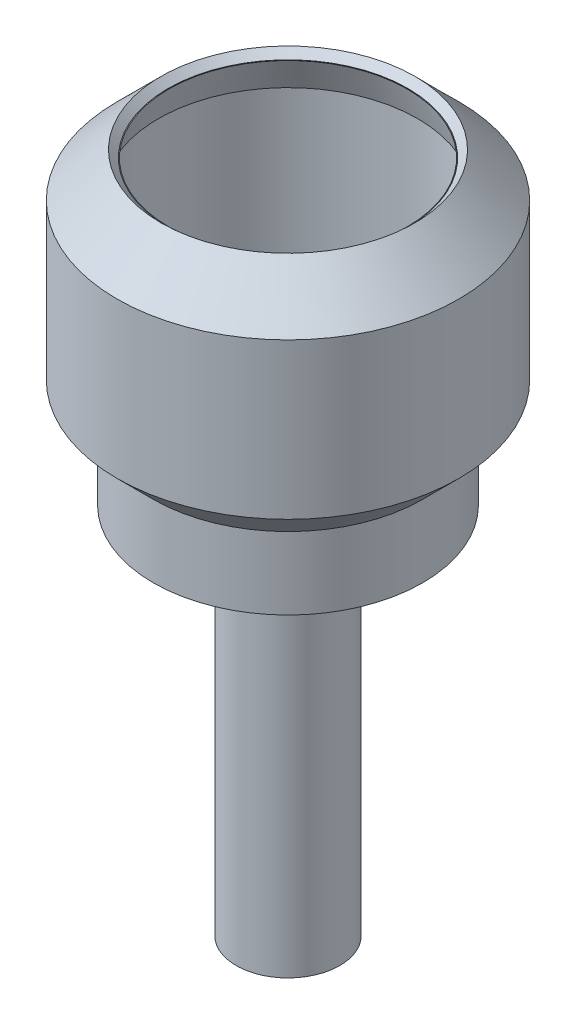
ISO-10303-21;
HEADER;
FILE_DESCRIPTION(('STEP AP214'),'2;1');
FILE_NAME('part.step','',(''),(''),'','','');
FILE_SCHEMA(('AUTOMOTIVE_DESIGN { 1 0 10303 214 1 1 1 1 }'));
ENDSEC;
DATA;
#1=APPLICATION_CONTEXT('core data for automotive mechanical design processes');
#2=APPLICATION_PROTOCOL_DEFINITION('international standard','automotive_design',2000,#1);
#3=PRODUCT_CONTEXT('',#1,'mechanical');
#4=PRODUCT('Part','Part','',(#3));
#5=PRODUCT_RELATED_PRODUCT_CATEGORY('part','',(#4));
#6=PRODUCT_DEFINITION_FORMATION('','',#4);
#7=PRODUCT_DEFINITION_CONTEXT('part definition',#1,'design');
#8=PRODUCT_DEFINITION('design','',#6,#7);
#9=PRODUCT_DEFINITION_SHAPE('','',#8);
#10=(LENGTH_UNIT() NAMED_UNIT(*) SI_UNIT(.MILLI.,.METRE.));
#11=(NAMED_UNIT(*) PLANE_ANGLE_UNIT() SI_UNIT($,.RADIAN.));
#12=(NAMED_UNIT(*) SI_UNIT($,.STERADIAN.) SOLID_ANGLE_UNIT());
#13=UNCERTAINTY_MEASURE_WITH_UNIT(LENGTH_MEASURE(1.E-05),#10,'distance_accuracy_value','');
#14=(GEOMETRIC_REPRESENTATION_CONTEXT(3) GLOBAL_UNCERTAINTY_ASSIGNED_CONTEXT((#13)) GLOBAL_UNIT_ASSIGNED_CONTEXT((#10,
#11,#12)) REPRESENTATION_CONTEXT('',''));
#15=CARTESIAN_POINT('',(0.,0.,0.));
#16=DIRECTION('',(0.,0.,1.));
#17=DIRECTION('',(1.,0.,0.));
#18=AXIS2_PLACEMENT_3D('',#15,#16,#17);
#19=CARTESIAN_POINT('',(0.,0.,0.));
#20=DIRECTION('',(0.,-1.,0.));
#21=DIRECTION('',(0.,0.,-1.));
#22=AXIS2_PLACEMENT_3D('',#19,#20,#21);
#23=PLANE('',#22);
#24=CARTESIAN_POINT('',(0.,0.,0.));
#25=DIRECTION('',(0.,-1.,0.));
#26=DIRECTION('',(0.,0.,-1.));
#27=AXIS2_PLACEMENT_3D('',#24,#25,#26);
#28=CIRCLE('',#27,2.5);
#29=CARTESIAN_POINT('',(0.,0.,-2.5));
#30=VERTEX_POINT('',#29);
#31=EDGE_CURVE('E41',#30,#30,#28,.T.);
#32=ORIENTED_EDGE('',*,*,#31,.F.);
#33=EDGE_LOOP('',(#32));
#34=FACE_BOUND('',#33,.T.);
#35=CARTESIAN_POINT('',(0.,0.,0.));
#36=DIRECTION('',(0.,1.,0.));
#37=DIRECTION('',(0.,0.,1.));
#38=AXIS2_PLACEMENT_3D('',#35,#36,#37);
#39=CIRCLE('',#38,6.5);
#40=CARTESIAN_POINT('',(0.,0.,6.5));
#41=VERTEX_POINT('',#40);
#42=EDGE_CURVE('E45',#41,#41,#39,.T.);
#43=ORIENTED_EDGE('',*,*,#42,.F.);
#44=EDGE_LOOP('',(#43));
#45=FACE_BOUND('',#44,.T.);
#46=ADVANCED_FACE('F35',(#34,#45),#23,.T.);
#47=CARTESIAN_POINT('',(0.,0.499999999999999,0.));
#48=DIRECTION('',(0.,1.,0.));
#49=DIRECTION('',(0.,0.,1.));
#50=AXIS2_PLACEMENT_3D('',#47,#48,#49);
#51=CYLINDRICAL_SURFACE('',#50,6.5);
#52=ORIENTED_EDGE('',*,*,#42,.T.);
#53=EDGE_LOOP('',(#52));
#54=FACE_BOUND('',#53,.T.);
#55=CARTESIAN_POINT('',(0.,3.48875000000002,0.));
#56=DIRECTION('',(0.,1.,0.));
#57=DIRECTION('',(0.,0.,1.));
#58=AXIS2_PLACEMENT_3D('',#55,#56,#57);
#59=CIRCLE('',#58,6.5);
#60=CARTESIAN_POINT('',(0.,3.48875000000002,6.5));
#61=VERTEX_POINT('',#60);
#62=EDGE_CURVE('E50',#61,#61,#59,.T.);
#63=ORIENTED_EDGE('',*,*,#62,.F.);
#64=EDGE_LOOP('',(#63));
#65=FACE_BOUND('',#64,.T.);
#66=ADVANCED_FACE('F73',(#54,#65),#51,.T.);
#67=CARTESIAN_POINT('',(0.,5.23875,0.));
#68=DIRECTION('',(0.,1.,0.));
#69=DIRECTION('',(0.,0.,1.));
#70=AXIS2_PLACEMENT_3D('',#67,#68,#69);
#71=CONICAL_SURFACE('',#70,8.25,0.785398163397454);
#72=ORIENTED_EDGE('',*,*,#62,.T.);
#73=EDGE_LOOP('',(#72));
#74=FACE_BOUND('',#73,.T.);
#75=CARTESIAN_POINT('',(0.,5.23875,0.));
#76=DIRECTION('',(0.,1.,0.));
#77=DIRECTION('',(0.,0.,1.));
#78=AXIS2_PLACEMENT_3D('',#75,#76,#77);
#79=CIRCLE('',#78,8.25);
#80=CARTESIAN_POINT('',(0.,5.23875,8.25));
#81=VERTEX_POINT('',#80);
#82=EDGE_CURVE('E64',#81,#81,#79,.T.);
#83=ORIENTED_EDGE('',*,*,#82,.F.);
#84=EDGE_LOOP('',(#83));
#85=FACE_BOUND('',#84,.T.);
#86=ADVANCED_FACE('F70',(#74,#85),#71,.T.);
#87=CARTESIAN_POINT('',(0.,0.499999999999999,0.));
#88=DIRECTION('',(0.,1.,0.));
#89=DIRECTION('',(0.,0.,1.));
#90=AXIS2_PLACEMENT_3D('',#87,#88,#89);
#91=CYLINDRICAL_SURFACE('',#90,8.25);
#92=ORIENTED_EDGE('',*,*,#82,.T.);
#93=EDGE_LOOP('',(#92));
#94=FACE_BOUND('',#93,.T.);
#95=CARTESIAN_POINT('',(0.,12.73875,0.));
#96=DIRECTION('',(0.,1.,0.));
#97=DIRECTION('',(0.,0.,1.));
#98=AXIS2_PLACEMENT_3D('',#95,#96,#97);
#99=CIRCLE('',#98,8.25);
#100=CARTESIAN_POINT('',(0.,12.73875,8.25));
#101=VERTEX_POINT('',#100);
#102=EDGE_CURVE('E61',#101,#101,#99,.T.);
#103=ORIENTED_EDGE('',*,*,#102,.F.);
#104=EDGE_LOOP('',(#103));
#105=FACE_BOUND('',#104,.T.);
#106=ADVANCED_FACE('F80',(#94,#105),#91,.T.);
#107=CARTESIAN_POINT('',(0.,14.8600703435597,0.));
#108=DIRECTION('',(0.,-1.,0.));
#109=DIRECTION('',(0.,0.,-1.));
#110=AXIS2_PLACEMENT_3D('',#107,#108,#109);
#111=CONICAL_SURFACE('',#110,6.12867965644037,0.785398163397445);
#112=ORIENTED_EDGE('',*,*,#102,.T.);
#113=EDGE_LOOP('',(#112));
#114=FACE_BOUND('',#113,.T.);
#115=CARTESIAN_POINT('',(0.,14.8600703435597,0.));
#116=DIRECTION('',(0.,1.,0.));
#117=DIRECTION('',(0.,0.,1.));
#118=AXIS2_PLACEMENT_3D('',#115,#116,#117);
#119=CIRCLE('',#118,6.12867965644037);
#120=CARTESIAN_POINT('',(0.,14.8600703435597,6.12867965644037));
#121=VERTEX_POINT('',#120);
#122=EDGE_CURVE('E58',#121,#121,#119,.T.);
#123=ORIENTED_EDGE('',*,*,#122,.F.);
#124=EDGE_LOOP('',(#123));
#125=FACE_BOUND('',#124,.T.);
#126=ADVANCED_FACE('F86',(#114,#125),#111,.T.);
#127=CARTESIAN_POINT('',(0.,14.5222946285709,0.));
#128=DIRECTION('',(0.,1.,0.));
#129=DIRECTION('',(0.,0.,1.));
#130=AXIS2_PLACEMENT_3D('',#127,#128,#129);
#131=CONICAL_SURFACE('',#130,5.79090394145166,0.78539816339745);
#132=ORIENTED_EDGE('',*,*,#122,.T.);
#133=EDGE_LOOP('',(#132));
#134=FACE_BOUND('',#133,.T.);
#135=CARTESIAN_POINT('',(0.,14.5222946285709,0.));
#136=DIRECTION('',(0.,1.,0.));
#137=DIRECTION('',(0.,0.,1.));
#138=AXIS2_PLACEMENT_3D('',#135,#136,#137);
#139=CIRCLE('',#138,5.79090394145166);
#140=CARTESIAN_POINT('',(0.,14.5222946285709,5.79090394145166));
#141=VERTEX_POINT('',#140);
#142=EDGE_CURVE('E55',#141,#141,#139,.T.);
#143=ORIENTED_EDGE('',*,*,#142,.F.);
#144=EDGE_LOOP('',(#143));
#145=FACE_BOUND('',#144,.T.);
#146=ADVANCED_FACE('F90',(#134,#145),#131,.F.);
#147=CARTESIAN_POINT('',(0.,12.5631985700226,0.));
#148=DIRECTION('',(0.,-1.,0.));
#149=DIRECTION('',(0.,0.,-1.));
#150=AXIS2_PLACEMENT_3D('',#147,#148,#149);
#151=CONICAL_SURFACE('',#150,7.75,0.785398163397446);
#152=CARTESIAN_POINT('',(0.,13.0945445753382,0.));
#153=DIRECTION('',(0.,-1.,0.));
#154=DIRECTION('',(0.,0.,-1.));
#155=AXIS2_PLACEMENT_3D('',#152,#153,#154);
#156=CIRCLE('',#155,7.21865399468441);
#157=CARTESIAN_POINT('',(0.,13.0945445753382,-7.21865399468441));
#158=VERTEX_POINT('',#157);
#159=EDGE_CURVE('E10',#158,#158,#156,.F.);
#160=ORIENTED_EDGE('',*,*,#159,.F.);
#161=EDGE_LOOP('',(#160));
#162=FACE_BOUND('',#161,.T.);
#163=ORIENTED_EDGE('',*,*,#142,.T.);
#164=EDGE_LOOP('',(#163));
#165=FACE_BOUND('',#164,.T.);
#166=ADVANCED_FACE('F94',(#162,#165),#151,.F.);
#167=CARTESIAN_POINT('',(0.,-18.,0.));
#168=DIRECTION('',(0.,1.,0.));
#169=DIRECTION('',(0.,0.,1.));
#170=AXIS2_PLACEMENT_3D('',#167,#168,#169);
#171=CYLINDRICAL_SURFACE('',#170,2.5);
#172=CARTESIAN_POINT('',(0.,-18.,0.));
#173=DIRECTION('',(0.,-1.,0.));
#174=DIRECTION('',(0.,0.,-1.));
#175=AXIS2_PLACEMENT_3D('',#172,#173,#174);
#176=CIRCLE('',#175,2.5);
#177=CARTESIAN_POINT('',(0.,-18.,-2.5));
#178=VERTEX_POINT('',#177);
#179=EDGE_CURVE('E53',#178,#178,#176,.T.);
#180=ORIENTED_EDGE('',*,*,#179,.F.);
#181=EDGE_LOOP('',(#180));
#182=FACE_BOUND('',#181,.T.);
#183=ORIENTED_EDGE('',*,*,#31,.T.);
#184=EDGE_LOOP('',(#183));
#185=FACE_BOUND('',#184,.T.);
#186=ADVANCED_FACE('F98',(#182,#185),#171,.T.);
#187=CARTESIAN_POINT('',(0.,-18.,0.));
#188=DIRECTION('',(0.,-1.,0.));
#189=DIRECTION('',(0.,0.,-1.));
#190=AXIS2_PLACEMENT_3D('',#187,#188,#189);
#191=PLANE('',#190);
#192=ORIENTED_EDGE('',*,*,#179,.T.);
#193=EDGE_LOOP('',(#192));
#194=FACE_BOUND('',#193,.T.);
#195=ADVANCED_FACE('F102',(#194),#191,.T.);
#196=CARTESIAN_POINT('',(0.,12.5721776821734,0.));
#197=DIRECTION('',(0.,-1.,0.));
#198=DIRECTION('',(0.,0.,-1.));
#199=AXIS2_PLACEMENT_3D('',#196,#197,#198);
#200=CONICAL_SURFACE('',#199,7.7565713985166,0.800063471440644);
#201=ORIENTED_EDGE('',*,*,#159,.T.);
#202=EDGE_LOOP('',(#201));
#203=FACE_BOUND('',#202,.T.);
#204=CARTESIAN_POINT('',(0.,14.5149903903246,0.));
#205=DIRECTION('',(0.,-1.,0.));
#206=DIRECTION('',(0.,0.,-1.));
#207=AXIS2_PLACEMENT_3D('',#204,#205,#206);
#208=CIRCLE('',#207,5.75592246426027);
#209=CARTESIAN_POINT('',(0.,14.5149903903246,-5.75592246426027));
#210=VERTEX_POINT('',#209);
#211=EDGE_CURVE('E137',#210,#210,#208,.T.);
#212=ORIENTED_EDGE('',*,*,#211,.T.);
#213=EDGE_LOOP('',(#212));
#214=FACE_BOUND('',#213,.T.);
#215=ADVANCED_FACE('F106',(#203,#214),#200,.T.);
#216=CARTESIAN_POINT('',(0.,1.15078773297483,0.));
#217=DIRECTION('',(0.,1.,0.));
#218=DIRECTION('',(0.,0.,1.));
#219=AXIS2_PLACEMENT_3D('',#216,#217,#218);
#220=PLANE('',#219);
#221=CARTESIAN_POINT('',(0.,1.15078773297483,0.));
#222=DIRECTION('',(0.,-1.,0.));
#223=DIRECTION('',(0.,0.,-1.));
#224=AXIS2_PLACEMENT_3D('',#221,#222,#223);
#225=CIRCLE('',#224,4.52635800407825);
#226=CARTESIAN_POINT('',(0.,1.15078773297483,-4.52635800407825));
#227=VERTEX_POINT('',#226);
#228=EDGE_CURVE('E147',#227,#227,#225,.T.);
#229=ORIENTED_EDGE('',*,*,#228,.F.);
#230=EDGE_LOOP('',(#229));
#231=FACE_BOUND('',#230,.T.);
#232=ADVANCED_FACE('F110',(#231),#220,.T.);
#233=CARTESIAN_POINT('',(0.,0.479711390489967,0.));
#234=DIRECTION('',(0.,-1.,0.));
#235=DIRECTION('',(0.,0.,-1.));
#236=AXIS2_PLACEMENT_3D('',#233,#234,#235);
#237=CYLINDRICAL_SURFACE('',#236,4.52635800407825);
#238=ORIENTED_EDGE('',*,*,#228,.T.);
#239=EDGE_LOOP('',(#238));
#240=FACE_BOUND('',#239,.T.);
#241=CARTESIAN_POINT('',(0.,4.08773786119099,0.));
#242=DIRECTION('',(0.,-1.,0.));
#243=DIRECTION('',(0.,0.,-1.));
#244=AXIS2_PLACEMENT_3D('',#241,#242,#243);
#245=CIRCLE('',#244,4.52635800407825);
#246=CARTESIAN_POINT('',(0.,4.08773786119099,-4.52635800407825));
#247=VERTEX_POINT('',#246);
#248=EDGE_CURVE('E145',#247,#247,#245,.T.);
#249=ORIENTED_EDGE('',*,*,#248,.F.);
#250=EDGE_LOOP('',(#249));
#251=FACE_BOUND('',#250,.T.);
#252=ADVANCED_FACE('F113',(#240,#251),#237,.F.);
#253=CARTESIAN_POINT('',(0.,5.86945854332165,0.));
#254=DIRECTION('',(0.,1.,0.));
#255=DIRECTION('',(0.,0.,1.));
#256=AXIS2_PLACEMENT_3D('',#253,#254,#255);
#257=CONICAL_SURFACE('',#256,6.2565713985166,0.770732855354253);
#258=ORIENTED_EDGE('',*,*,#248,.T.);
#259=EDGE_LOOP('',(#258));
#260=FACE_BOUND('',#259,.T.);
#261=CARTESIAN_POINT('',(0.,5.86945854332165,0.));
#262=DIRECTION('',(0.,-1.,0.));
#263=DIRECTION('',(0.,0.,-1.));
#264=AXIS2_PLACEMENT_3D('',#261,#262,#263);
#265=CIRCLE('',#264,6.2565713985166);
#266=CARTESIAN_POINT('',(0.,5.86945854332165,-6.2565713985166));
#267=VERTEX_POINT('',#266);
#268=EDGE_CURVE('E140',#267,#267,#265,.T.);
#269=ORIENTED_EDGE('',*,*,#268,.F.);
#270=EDGE_LOOP('',(#269));
#271=FACE_BOUND('',#270,.T.);
#272=ADVANCED_FACE('F117',(#260,#271),#257,.F.);
#273=CARTESIAN_POINT('',(0.,0.479711390489967,0.));
#274=DIRECTION('',(0.,-1.,0.));
#275=DIRECTION('',(0.,0.,-1.));
#276=AXIS2_PLACEMENT_3D('',#273,#274,#275);
#277=CYLINDRICAL_SURFACE('',#276,6.2565713985166);
#278=ORIENTED_EDGE('',*,*,#268,.T.);
#279=EDGE_LOOP('',(#278));
#280=FACE_BOUND('',#279,.T.);
#281=CARTESIAN_POINT('',(0.,13.0290334992261,0.));
#282=DIRECTION('',(0.,-1.,0.));
#283=DIRECTION('',(0.,0.,-1.));
#284=AXIS2_PLACEMENT_3D('',#281,#282,#283);
#285=CIRCLE('',#284,6.2565713985166);
#286=CARTESIAN_POINT('',(0.,13.0290334992261,-6.2565713985166));
#287=VERTEX_POINT('',#286);
#288=EDGE_CURVE('E134',#287,#287,#285,.T.);
#289=ORIENTED_EDGE('',*,*,#288,.F.);
#290=EDGE_LOOP('',(#289));
#291=FACE_BOUND('',#290,.T.);
#292=ADVANCED_FACE('F121',(#280,#291),#277,.F.);
#293=CARTESIAN_POINT('',(0.,14.5149903903246,0.));
#294=DIRECTION('',(0.,-1.,0.));
#295=DIRECTION('',(0.,0.,-1.));
#296=AXIS2_PLACEMENT_3D('',#293,#294,#295);
#297=CONICAL_SURFACE('',#296,5.75592246426027,0.324975278207487);
#298=ORIENTED_EDGE('',*,*,#288,.T.);
#299=EDGE_LOOP('',(#298));
#300=FACE_BOUND('',#299,.T.);
#301=ORIENTED_EDGE('',*,*,#211,.F.);
#302=EDGE_LOOP('',(#301));
#303=FACE_BOUND('',#302,.T.);
#304=ADVANCED_FACE('F125',(#300,#303),#297,.F.);
#305=CLOSED_SHELL('',(#46,#66,#86,#106,#126,#146,#166,#186,#195,#215,#232,#252,#272,#292,#304));
#306=MANIFOLD_SOLID_BREP('B2',#305);
#307=ADVANCED_BREP_SHAPE_REPRESENTATION('',(#18,#306),#14);
#308=SHAPE_DEFINITION_REPRESENTATION(#9,#307);
ENDSEC;
END-ISO-10303-21;
